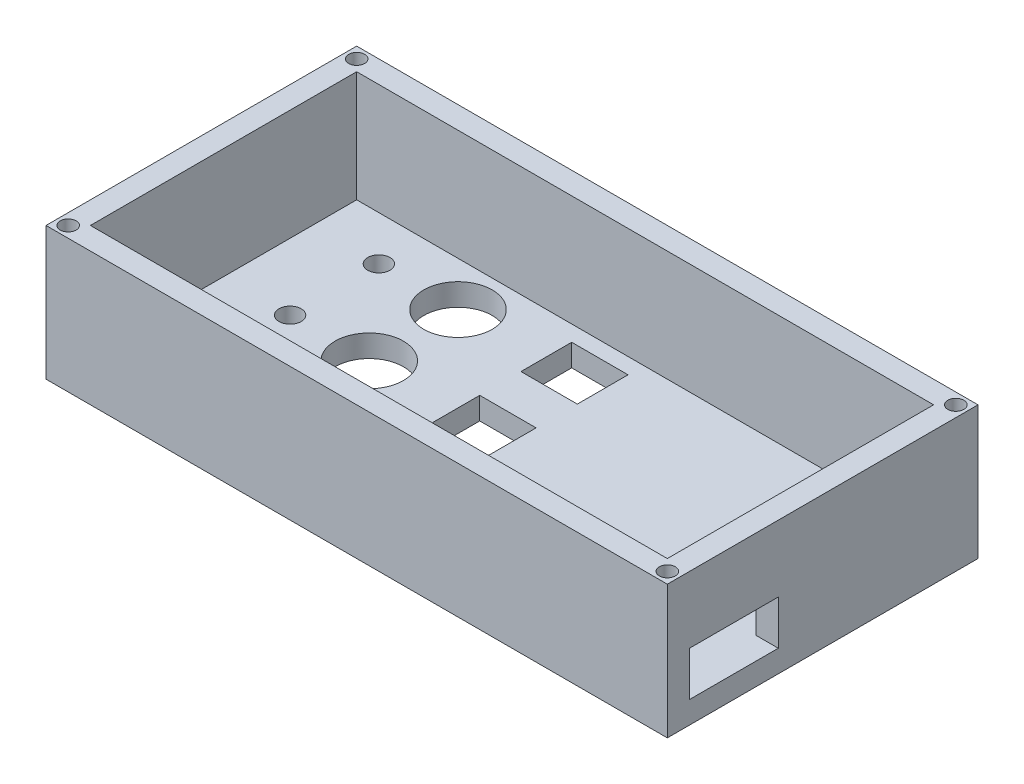
ISO-10303-21;
HEADER;
FILE_DESCRIPTION(('STEP AP214'),'2;1');
FILE_NAME('part.step','',(''),(''),'','','');
FILE_SCHEMA(('AUTOMOTIVE_DESIGN { 1 0 10303 214 1 1 1 1 }'));
ENDSEC;
DATA;
#1=APPLICATION_CONTEXT('core data for automotive mechanical design processes');
#2=APPLICATION_PROTOCOL_DEFINITION('international standard','automotive_design',2000,#1);
#3=PRODUCT_CONTEXT('',#1,'mechanical');
#4=PRODUCT('Part','Part','',(#3));
#5=PRODUCT_RELATED_PRODUCT_CATEGORY('part','',(#4));
#6=PRODUCT_DEFINITION_FORMATION('','',#4);
#7=PRODUCT_DEFINITION_CONTEXT('part definition',#1,'design');
#8=PRODUCT_DEFINITION('design','',#6,#7);
#9=PRODUCT_DEFINITION_SHAPE('','',#8);
#10=(LENGTH_UNIT() NAMED_UNIT(*) SI_UNIT(.MILLI.,.METRE.));
#11=(NAMED_UNIT(*) PLANE_ANGLE_UNIT() SI_UNIT($,.RADIAN.));
#12=(NAMED_UNIT(*) SI_UNIT($,.STERADIAN.) SOLID_ANGLE_UNIT());
#13=UNCERTAINTY_MEASURE_WITH_UNIT(LENGTH_MEASURE(1.E-05),#10,'distance_accuracy_value','');
#14=(GEOMETRIC_REPRESENTATION_CONTEXT(3) GLOBAL_UNCERTAINTY_ASSIGNED_CONTEXT((#13)) GLOBAL_UNIT_ASSIGNED_CONTEXT((#10,
#11,#12)) REPRESENTATION_CONTEXT('',''));
#15=CARTESIAN_POINT('',(0.,0.,0.));
#16=DIRECTION('',(0.,0.,1.));
#17=DIRECTION('',(1.,0.,0.));
#18=AXIS2_PLACEMENT_3D('',#15,#16,#17);
#19=CARTESIAN_POINT('',(135.,5.,0.));
#20=DIRECTION('',(1.,0.,0.));
#21=DIRECTION('',(0.,0.,-1.));
#22=AXIS2_PLACEMENT_3D('',#19,#20,#21);
#23=PLANE('',#22);
#24=DIRECTION('',(0.,0.,-1.));
#25=VECTOR('',#24,1.);
#26=CARTESIAN_POINT('',(135.,15.,0.));
#27=LINE('',#26,#25);
#28=CARTESIAN_POINT('',(135.,15.,-5.));
#29=VERTEX_POINT('',#28);
#30=CARTESIAN_POINT('',(135.,15.,-25.));
#31=VERTEX_POINT('',#30);
#32=EDGE_CURVE('E12',#29,#31,#27,.T.);
#33=ORIENTED_EDGE('',*,*,#32,.F.);
#34=DIRECTION('',(0.,1.,0.));
#35=VECTOR('',#34,1.);
#36=CARTESIAN_POINT('',(135.,5.,-5.));
#37=LINE('',#36,#35);
#38=CARTESIAN_POINT('',(135.,30.,-5.));
#39=VERTEX_POINT('',#38);
#40=EDGE_CURVE('E345',#29,#39,#37,.T.);
#41=ORIENTED_EDGE('',*,*,#40,.T.);
#42=DIRECTION('',(0.,0.,-1.));
#43=VECTOR('',#42,1.);
#44=CARTESIAN_POINT('',(135.,30.,0.));
#45=LINE('',#44,#43);
#46=CARTESIAN_POINT('',(135.,30.,-65.));
#47=VERTEX_POINT('',#46);
#48=EDGE_CURVE('E349',#39,#47,#45,.T.);
#49=ORIENTED_EDGE('',*,*,#48,.T.);
#50=DIRECTION('',(0.,1.,0.));
#51=VECTOR('',#50,1.);
#52=CARTESIAN_POINT('',(135.,5.,-65.));
#53=LINE('',#52,#51);
#54=CARTESIAN_POINT('',(135.,5.,-65.));
#55=VERTEX_POINT('',#54);
#56=EDGE_CURVE('E363',#55,#47,#53,.T.);
#57=ORIENTED_EDGE('',*,*,#56,.F.);
#58=DIRECTION('',(0.,0.,-1.));
#59=VECTOR('',#58,1.);
#60=CARTESIAN_POINT('',(135.,5.,0.));
#61=LINE('',#60,#59);
#62=CARTESIAN_POINT('',(135.,5.,-25.));
#63=VERTEX_POINT('',#62);
#64=EDGE_CURVE('E337',#63,#55,#61,.T.);
#65=ORIENTED_EDGE('',*,*,#64,.F.);
#66=DIRECTION('',(0.,1.,0.));
#67=VECTOR('',#66,1.);
#68=CARTESIAN_POINT('',(135.,5.,-25.));
#69=LINE('',#68,#67);
#70=EDGE_CURVE('E50',#63,#31,#69,.T.);
#71=ORIENTED_EDGE('',*,*,#70,.T.);
#72=EDGE_LOOP('',(#33,#41,#49,#57,#65,#71));
#73=FACE_BOUND('',#72,.T.);
#74=ADVANCED_FACE('F42',(#73),#23,.F.);
#75=CARTESIAN_POINT('',(0.,0.,0.));
#76=DIRECTION('',(0.,1.,0.));
#77=DIRECTION('',(0.,0.,1.));
#78=AXIS2_PLACEMENT_3D('',#75,#76,#77);
#79=PLANE('',#78);
#80=CARTESIAN_POINT('',(20.,0.,-15.));
#81=DIRECTION('',(0.,-1.,0.));
#82=DIRECTION('',(0.,0.,-1.));
#83=AXIS2_PLACEMENT_3D('',#80,#81,#82);
#84=CIRCLE('',#83,2.5);
#85=CARTESIAN_POINT('',(20.,0.,-17.5));
#86=VERTEX_POINT('',#85);
#87=EDGE_CURVE('E324',#86,#86,#84,.T.);
#88=ORIENTED_EDGE('',*,*,#87,.F.);
#89=EDGE_LOOP('',(#88));
#90=FACE_BOUND('',#89,.T.);
#91=CARTESIAN_POINT('',(37.8338224720955,0.,-15.));
#92=DIRECTION('',(0.,-1.,0.));
#93=DIRECTION('',(0.,0.,-1.));
#94=AXIS2_PLACEMENT_3D('',#91,#92,#93);
#95=CIRCLE('',#94,7.7);
#96=CARTESIAN_POINT('',(37.8338224720955,0.,-22.7));
#97=VERTEX_POINT('',#96);
#98=EDGE_CURVE('E300',#97,#97,#95,.T.);
#99=ORIENTED_EDGE('',*,*,#98,.F.);
#100=EDGE_LOOP('',(#99));
#101=FACE_BOUND('',#100,.T.);
#102=DIRECTION('',(0.,0.,-1.));
#103=VECTOR('',#102,1.);
#104=CARTESIAN_POINT('',(69.717644944191,0.,-50.));
#105=LINE('',#104,#103);
#106=CARTESIAN_POINT('',(69.717644944191,0.,-50.));
#107=VERTEX_POINT('',#106);
#108=CARTESIAN_POINT('',(69.717644944191,0.,-61.43));
#109=VERTEX_POINT('',#108);
#110=EDGE_CURVE('E270',#107,#109,#105,.T.);
#111=ORIENTED_EDGE('',*,*,#110,.T.);
#112=DIRECTION('',(1.,0.,0.));
#113=VECTOR('',#112,1.);
#114=CARTESIAN_POINT('',(57.017644944191,0.,-61.43));
#115=LINE('',#114,#113);
#116=CARTESIAN_POINT('',(57.017644944191,0.,-61.43));
#117=VERTEX_POINT('',#116);
#118=EDGE_CURVE('E273',#117,#109,#115,.T.);
#119=ORIENTED_EDGE('',*,*,#118,.F.);
#120=DIRECTION('',(0.,0.,-1.));
#121=VECTOR('',#120,1.);
#122=CARTESIAN_POINT('',(57.017644944191,0.,-50.));
#123=LINE('',#122,#121);
#124=CARTESIAN_POINT('',(57.017644944191,0.,-50.));
#125=VERTEX_POINT('',#124);
#126=EDGE_CURVE('E258',#125,#117,#123,.T.);
#127=ORIENTED_EDGE('',*,*,#126,.F.);
#128=DIRECTION('',(1.,0.,0.));
#129=VECTOR('',#128,1.);
#130=CARTESIAN_POINT('',(57.017644944191,0.,-50.));
#131=LINE('',#130,#129);
#132=EDGE_CURVE('E267',#125,#107,#131,.T.);
#133=ORIENTED_EDGE('',*,*,#132,.T.);
#134=EDGE_LOOP('',(#111,#119,#127,#133));
#135=FACE_BOUND('',#134,.T.);
#136=DIRECTION('',(1.,0.,0.));
#137=VECTOR('',#136,1.);
#138=CARTESIAN_POINT('',(0.,0.,-70.));
#139=LINE('',#138,#137);
#140=CARTESIAN_POINT('',(0.,0.,-70.));
#141=VERTEX_POINT('',#140);
#142=CARTESIAN_POINT('',(140.,0.,-70.));
#143=VERTEX_POINT('',#142);
#144=EDGE_CURVE('E360',#141,#143,#139,.T.);
#145=ORIENTED_EDGE('',*,*,#144,.T.);
#146=DIRECTION('',(0.,0.,-1.));
#147=VECTOR('',#146,1.);
#148=CARTESIAN_POINT('',(140.,0.,0.));
#149=LINE('',#148,#147);
#150=CARTESIAN_POINT('',(140.,0.,0.));
#151=VERTEX_POINT('',#150);
#152=EDGE_CURVE('E380',#151,#143,#149,.T.);
#153=ORIENTED_EDGE('',*,*,#152,.F.);
#154=DIRECTION('',(1.,0.,0.));
#155=VECTOR('',#154,1.);
#156=CARTESIAN_POINT('',(0.,0.,0.));
#157=LINE('',#156,#155);
#158=CARTESIAN_POINT('',(0.,0.,0.));
#159=VERTEX_POINT('',#158);
#160=EDGE_CURVE('E383',#159,#151,#157,.T.);
#161=ORIENTED_EDGE('',*,*,#160,.F.);
#162=DIRECTION('',(0.,0.,-1.));
#163=VECTOR('',#162,1.);
#164=CARTESIAN_POINT('',(0.,0.,0.));
#165=LINE('',#164,#163);
#166=EDGE_CURVE('E370',#159,#141,#165,.T.);
#167=ORIENTED_EDGE('',*,*,#166,.T.);
#168=EDGE_LOOP('',(#145,#153,#161,#167));
#169=FACE_BOUND('',#168,.T.);
#170=CARTESIAN_POINT('',(20.,0.,-55.));
#171=DIRECTION('',(0.,-1.,0.));
#172=DIRECTION('',(0.,0.,-1.));
#173=AXIS2_PLACEMENT_3D('',#170,#171,#172);
#174=CIRCLE('',#173,2.5);
#175=CARTESIAN_POINT('',(20.,0.,-57.5));
#176=VERTEX_POINT('',#175);
#177=EDGE_CURVE('E323',#176,#176,#174,.F.);
#178=ORIENTED_EDGE('',*,*,#177,.T.);
#179=EDGE_LOOP('',(#178));
#180=FACE_BOUND('',#179,.T.);
#181=DIRECTION('',(0.,0.,1.));
#182=VECTOR('',#181,1.);
#183=CARTESIAN_POINT('',(57.017644944191,0.,-15.));
#184=LINE('',#183,#182);
#185=CARTESIAN_POINT('',(57.017644944191,0.,-20.));
#186=VERTEX_POINT('',#185);
#187=CARTESIAN_POINT('',(57.017644944191,0.,-8.57000000000001));
#188=VERTEX_POINT('',#187);
#189=EDGE_CURVE('E297',#186,#188,#184,.T.);
#190=ORIENTED_EDGE('',*,*,#189,.T.);
#191=DIRECTION('',(1.,0.,0.));
#192=VECTOR('',#191,1.);
#193=CARTESIAN_POINT('',(57.017644944191,0.,-8.57000000000001));
#194=LINE('',#193,#192);
#195=CARTESIAN_POINT('',(69.717644944191,0.,-8.57000000000001));
#196=VERTEX_POINT('',#195);
#197=EDGE_CURVE('E294',#188,#196,#194,.T.);
#198=ORIENTED_EDGE('',*,*,#197,.T.);
#199=DIRECTION('',(0.,0.,-1.));
#200=VECTOR('',#199,1.);
#201=CARTESIAN_POINT('',(69.717644944191,0.,-8.57000000000001));
#202=LINE('',#201,#200);
#203=CARTESIAN_POINT('',(69.717644944191,0.,-20.));
#204=VERTEX_POINT('',#203);
#205=EDGE_CURVE('E291',#196,#204,#202,.T.);
#206=ORIENTED_EDGE('',*,*,#205,.T.);
#207=DIRECTION('',(-1.,0.,0.));
#208=VECTOR('',#207,1.);
#209=CARTESIAN_POINT('',(69.717644944191,0.,-20.));
#210=LINE('',#209,#208);
#211=EDGE_CURVE('E288',#204,#186,#210,.T.);
#212=ORIENTED_EDGE('',*,*,#211,.T.);
#213=EDGE_LOOP('',(#190,#198,#206,#212));
#214=FACE_BOUND('',#213,.T.);
#215=DIRECTION('',(1.,0.,0.));
#216=VECTOR('',#215,1.);
#217=CARTESIAN_POINT('',(57.017644944191,0.,-29.285));
#218=LINE('',#217,#216);
#219=CARTESIAN_POINT('',(57.017644944191,0.,-29.285));
#220=VERTEX_POINT('',#219);
#221=CARTESIAN_POINT('',(69.717644944191,0.,-29.285));
#222=VERTEX_POINT('',#221);
#223=EDGE_CURVE('E281',#220,#222,#218,.T.);
#224=ORIENTED_EDGE('',*,*,#223,.T.);
#225=DIRECTION('',(0.,0.,1.));
#226=VECTOR('',#225,1.);
#227=CARTESIAN_POINT('',(69.717644944191,0.,-40.715));
#228=LINE('',#227,#226);
#229=CARTESIAN_POINT('',(69.717644944191,0.,-40.715));
#230=VERTEX_POINT('',#229);
#231=EDGE_CURVE('E315',#230,#222,#228,.T.);
#232=ORIENTED_EDGE('',*,*,#231,.F.);
#233=DIRECTION('',(1.,0.,0.));
#234=VECTOR('',#233,1.);
#235=CARTESIAN_POINT('',(57.017644944191,0.,-40.715));
#236=LINE('',#235,#234);
#237=CARTESIAN_POINT('',(57.017644944191,0.,-40.715));
#238=VERTEX_POINT('',#237);
#239=EDGE_CURVE('E312',#238,#230,#236,.T.);
#240=ORIENTED_EDGE('',*,*,#239,.F.);
#241=DIRECTION('',(0.,0.,1.));
#242=VECTOR('',#241,1.);
#243=CARTESIAN_POINT('',(57.017644944191,0.,-40.715));
#244=LINE('',#243,#242);
#245=EDGE_CURVE('E309',#238,#220,#244,.T.);
#246=ORIENTED_EDGE('',*,*,#245,.T.);
#247=EDGE_LOOP('',(#224,#232,#240,#246));
#248=FACE_BOUND('',#247,.T.);
#249=CARTESIAN_POINT('',(37.8338224720955,0.,-35.));
#250=DIRECTION('',(0.,-1.,0.));
#251=DIRECTION('',(0.,0.,-1.));
#252=AXIS2_PLACEMENT_3D('',#249,#250,#251);
#253=CIRCLE('',#252,7.7);
#254=CARTESIAN_POINT('',(37.8338224720955,0.,-42.7));
#255=VERTEX_POINT('',#254);
#256=EDGE_CURVE('E252',#255,#255,#253,.T.);
#257=ORIENTED_EDGE('',*,*,#256,.F.);
#258=EDGE_LOOP('',(#257));
#259=FACE_BOUND('',#258,.T.);
#260=CARTESIAN_POINT('',(37.8338224720955,0.,-55.));
#261=DIRECTION('',(0.,-1.,0.));
#262=DIRECTION('',(0.,0.,-1.));
#263=AXIS2_PLACEMENT_3D('',#260,#261,#262);
#264=CIRCLE('',#263,7.7);
#265=CARTESIAN_POINT('',(37.8338224720955,0.,-62.7));
#266=VERTEX_POINT('',#265);
#267=EDGE_CURVE('E327',#266,#266,#264,.T.);
#268=ORIENTED_EDGE('',*,*,#267,.F.);
#269=EDGE_LOOP('',(#268));
#270=FACE_BOUND('',#269,.T.);
#271=CARTESIAN_POINT('',(20.,0.,-35.));
#272=DIRECTION('',(0.,-1.,0.));
#273=DIRECTION('',(0.,0.,-1.));
#274=AXIS2_PLACEMENT_3D('',#271,#272,#273);
#275=CIRCLE('',#274,2.5);
#276=CARTESIAN_POINT('',(20.,0.,-37.5));
#277=VERTEX_POINT('',#276);
#278=EDGE_CURVE('E320',#277,#277,#275,.T.);
#279=ORIENTED_EDGE('',*,*,#278,.F.);
#280=EDGE_LOOP('',(#279));
#281=FACE_BOUND('',#280,.T.);
#282=ADVANCED_FACE('F491',(#90,#101,#135,#169,#180,#214,#248,#259,#270,#281),#79,.F.);
#283=CARTESIAN_POINT('',(0.,5.,0.));
#284=DIRECTION('',(0.,1.,0.));
#285=DIRECTION('',(0.,0.,1.));
#286=AXIS2_PLACEMENT_3D('',#283,#284,#285);
#287=PLANE('',#286);
#288=DIRECTION('',(1.,0.,0.));
#289=VECTOR('',#288,1.);
#290=CARTESIAN_POINT('',(115.,5.,-25.));
#291=LINE('',#290,#289);
#292=CARTESIAN_POINT('',(140.,5.,-25.));
#293=VERTEX_POINT('',#292);
#294=EDGE_CURVE('E249',#63,#293,#291,.T.);
#295=ORIENTED_EDGE('',*,*,#294,.F.);
#296=ORIENTED_EDGE('',*,*,#64,.T.);
#297=DIRECTION('',(1.,0.,0.));
#298=VECTOR('',#297,1.);
#299=CARTESIAN_POINT('',(0.,5.,-65.));
#300=LINE('',#299,#298);
#301=CARTESIAN_POINT('',(5.,5.,-65.));
#302=VERTEX_POINT('',#301);
#303=EDGE_CURVE('E340',#302,#55,#300,.T.);
#304=ORIENTED_EDGE('',*,*,#303,.F.);
#305=DIRECTION('',(0.,0.,-1.));
#306=VECTOR('',#305,1.);
#307=CARTESIAN_POINT('',(5.,5.,0.));
#308=LINE('',#307,#306);
#309=CARTESIAN_POINT('',(5.,5.,-5.));
#310=VERTEX_POINT('',#309);
#311=EDGE_CURVE('E343',#310,#302,#308,.T.);
#312=ORIENTED_EDGE('',*,*,#311,.F.);
#313=DIRECTION('',(1.,0.,0.));
#314=VECTOR('',#313,1.);
#315=CARTESIAN_POINT('',(0.,5.,-5.));
#316=LINE('',#315,#314);
#317=CARTESIAN_POINT('',(140.,5.,-5.));
#318=VERTEX_POINT('',#317);
#319=EDGE_CURVE('E335',#310,#318,#316,.T.);
#320=ORIENTED_EDGE('',*,*,#319,.T.);
#321=DIRECTION('',(0.,0.,-1.));
#322=VECTOR('',#321,1.);
#323=CARTESIAN_POINT('',(140.,5.,0.));
#324=LINE('',#323,#322);
#325=EDGE_CURVE('E57',#318,#293,#324,.T.);
#326=ORIENTED_EDGE('',*,*,#325,.T.);
#327=EDGE_LOOP('',(#295,#296,#304,#312,#320,#326));
#328=FACE_BOUND('',#327,.T.);
#329=CARTESIAN_POINT('',(20.,5.,-55.));
#330=DIRECTION('',(0.,1.,0.));
#331=DIRECTION('',(0.,0.,1.));
#332=AXIS2_PLACEMENT_3D('',#329,#330,#331);
#333=CIRCLE('',#332,2.5);
#334=CARTESIAN_POINT('',(20.,5.,-52.5));
#335=VERTEX_POINT('',#334);
#336=EDGE_CURVE('E334',#335,#335,#333,.F.);
#337=ORIENTED_EDGE('',*,*,#336,.T.);
#338=EDGE_LOOP('',(#337));
#339=FACE_BOUND('',#338,.T.);
#340=DIRECTION('',(-1.,0.,0.));
#341=VECTOR('',#340,1.);
#342=CARTESIAN_POINT('',(0.,5.,-8.57000000000001));
#343=LINE('',#342,#341);
#344=CARTESIAN_POINT('',(69.717644944191,5.,-8.57000000000001));
#345=VERTEX_POINT('',#344);
#346=CARTESIAN_POINT('',(57.017644944191,5.,-8.57000000000001));
#347=VERTEX_POINT('',#346);
#348=EDGE_CURVE('E404',#345,#347,#343,.T.);
#349=ORIENTED_EDGE('',*,*,#348,.T.);
#350=DIRECTION('',(0.,0.,-1.));
#351=VECTOR('',#350,1.);
#352=CARTESIAN_POINT('',(57.017644944191,5.,0.));
#353=LINE('',#352,#351);
#354=CARTESIAN_POINT('',(57.017644944191,5.,-20.));
#355=VERTEX_POINT('',#354);
#356=EDGE_CURVE('E407',#347,#355,#353,.T.);
#357=ORIENTED_EDGE('',*,*,#356,.T.);
#358=DIRECTION('',(1.,0.,0.));
#359=VECTOR('',#358,1.);
#360=CARTESIAN_POINT('',(0.,5.,-20.));
#361=LINE('',#360,#359);
#362=CARTESIAN_POINT('',(69.717644944191,5.,-20.));
#363=VERTEX_POINT('',#362);
#364=EDGE_CURVE('E389',#355,#363,#361,.T.);
#365=ORIENTED_EDGE('',*,*,#364,.T.);
#366=DIRECTION('',(0.,0.,1.));
#367=VECTOR('',#366,1.);
#368=CARTESIAN_POINT('',(69.717644944191,5.,0.));
#369=LINE('',#368,#367);
#370=EDGE_CURVE('E401',#363,#345,#369,.T.);
#371=ORIENTED_EDGE('',*,*,#370,.T.);
#372=EDGE_LOOP('',(#349,#357,#365,#371));
#373=FACE_BOUND('',#372,.T.);
#374=DIRECTION('',(0.,0.,-1.));
#375=VECTOR('',#374,1.);
#376=CARTESIAN_POINT('',(69.717644944191,5.,0.));
#377=LINE('',#376,#375);
#378=CARTESIAN_POINT('',(69.717644944191,5.,-29.285));
#379=VERTEX_POINT('',#378);
#380=CARTESIAN_POINT('',(69.717644944191,5.,-40.715));
#381=VERTEX_POINT('',#380);
#382=EDGE_CURVE('E416',#379,#381,#377,.T.);
#383=ORIENTED_EDGE('',*,*,#382,.F.);
#384=DIRECTION('',(-1.,0.,0.));
#385=VECTOR('',#384,1.);
#386=CARTESIAN_POINT('',(0.,5.,-29.285));
#387=LINE('',#386,#385);
#388=CARTESIAN_POINT('',(57.017644944191,5.,-29.285));
#389=VERTEX_POINT('',#388);
#390=EDGE_CURVE('E418',#379,#389,#387,.T.);
#391=ORIENTED_EDGE('',*,*,#390,.T.);
#392=DIRECTION('',(0.,0.,-1.));
#393=VECTOR('',#392,1.);
#394=CARTESIAN_POINT('',(57.017644944191,5.,0.));
#395=LINE('',#394,#393);
#396=CARTESIAN_POINT('',(57.017644944191,5.,-40.715));
#397=VERTEX_POINT('',#396);
#398=EDGE_CURVE('E410',#389,#397,#395,.T.);
#399=ORIENTED_EDGE('',*,*,#398,.T.);
#400=DIRECTION('',(-1.,0.,0.));
#401=VECTOR('',#400,1.);
#402=CARTESIAN_POINT('',(0.,5.,-40.715));
#403=LINE('',#402,#401);
#404=EDGE_CURVE('E413',#381,#397,#403,.T.);
#405=ORIENTED_EDGE('',*,*,#404,.F.);
#406=EDGE_LOOP('',(#383,#391,#399,#405));
#407=FACE_BOUND('',#406,.T.);
#408=DIRECTION('',(-1.,0.,0.));
#409=VECTOR('',#408,1.);
#410=CARTESIAN_POINT('',(0.,5.,-61.43));
#411=LINE('',#410,#409);
#412=CARTESIAN_POINT('',(69.717644944191,5.,-61.43));
#413=VERTEX_POINT('',#412);
#414=CARTESIAN_POINT('',(57.017644944191,5.,-61.43));
#415=VERTEX_POINT('',#414);
#416=EDGE_CURVE('E429',#413,#415,#411,.T.);
#417=ORIENTED_EDGE('',*,*,#416,.F.);
#418=DIRECTION('',(0.,0.,1.));
#419=VECTOR('',#418,1.);
#420=CARTESIAN_POINT('',(69.717644944191,5.,0.));
#421=LINE('',#420,#419);
#422=CARTESIAN_POINT('',(69.717644944191,5.,-50.));
#423=VERTEX_POINT('',#422);
#424=EDGE_CURVE('E421',#413,#423,#421,.T.);
#425=ORIENTED_EDGE('',*,*,#424,.T.);
#426=DIRECTION('',(-1.,0.,0.));
#427=VECTOR('',#426,1.);
#428=CARTESIAN_POINT('',(0.,5.,-50.));
#429=LINE('',#428,#427);
#430=CARTESIAN_POINT('',(57.017644944191,5.,-50.));
#431=VERTEX_POINT('',#430);
#432=EDGE_CURVE('E424',#423,#431,#429,.T.);
#433=ORIENTED_EDGE('',*,*,#432,.T.);
#434=DIRECTION('',(0.,0.,1.));
#435=VECTOR('',#434,1.);
#436=CARTESIAN_POINT('',(57.017644944191,5.,0.));
#437=LINE('',#436,#435);
#438=EDGE_CURVE('E427',#415,#431,#437,.T.);
#439=ORIENTED_EDGE('',*,*,#438,.F.);
#440=EDGE_LOOP('',(#417,#425,#433,#439));
#441=FACE_BOUND('',#440,.T.);
#442=CARTESIAN_POINT('',(37.8338224720955,5.,-35.));
#443=DIRECTION('',(0.,1.,0.));
#444=DIRECTION('',(0.,0.,1.));
#445=AXIS2_PLACEMENT_3D('',#442,#443,#444);
#446=CIRCLE('',#445,7.7);
#447=CARTESIAN_POINT('',(37.8338224720955,5.,-27.3));
#448=VERTEX_POINT('',#447);
#449=EDGE_CURVE('E398',#448,#448,#446,.T.);
#450=ORIENTED_EDGE('',*,*,#449,.F.);
#451=EDGE_LOOP('',(#450));
#452=FACE_BOUND('',#451,.T.);
#453=CARTESIAN_POINT('',(37.8338224720955,5.,-15.));
#454=DIRECTION('',(0.,1.,0.));
#455=DIRECTION('',(0.,0.,1.));
#456=AXIS2_PLACEMENT_3D('',#453,#454,#455);
#457=CIRCLE('',#456,7.7);
#458=CARTESIAN_POINT('',(37.8338224720955,5.,-7.3));
#459=VERTEX_POINT('',#458);
#460=EDGE_CURVE('E433',#459,#459,#457,.T.);
#461=ORIENTED_EDGE('',*,*,#460,.F.);
#462=EDGE_LOOP('',(#461));
#463=FACE_BOUND('',#462,.T.);
#464=CARTESIAN_POINT('',(37.8338224720955,5.,-55.));
#465=DIRECTION('',(0.,1.,0.));
#466=DIRECTION('',(0.,0.,1.));
#467=AXIS2_PLACEMENT_3D('',#464,#465,#466);
#468=CIRCLE('',#467,7.7);
#469=CARTESIAN_POINT('',(37.8338224720955,5.,-47.3));
#470=VERTEX_POINT('',#469);
#471=EDGE_CURVE('E436',#470,#470,#468,.T.);
#472=ORIENTED_EDGE('',*,*,#471,.F.);
#473=EDGE_LOOP('',(#472));
#474=FACE_BOUND('',#473,.T.);
#475=CARTESIAN_POINT('',(20.,5.,-15.));
#476=DIRECTION('',(0.,1.,0.));
#477=DIRECTION('',(0.,0.,1.));
#478=AXIS2_PLACEMENT_3D('',#475,#476,#477);
#479=CIRCLE('',#478,2.5);
#480=CARTESIAN_POINT('',(20.,5.,-12.5));
#481=VERTEX_POINT('',#480);
#482=EDGE_CURVE('E439',#481,#481,#479,.T.);
#483=ORIENTED_EDGE('',*,*,#482,.F.);
#484=EDGE_LOOP('',(#483));
#485=FACE_BOUND('',#484,.T.);
#486=CARTESIAN_POINT('',(20.,5.,-35.));
#487=DIRECTION('',(0.,1.,0.));
#488=DIRECTION('',(0.,0.,1.));
#489=AXIS2_PLACEMENT_3D('',#486,#487,#488);
#490=CIRCLE('',#489,2.5);
#491=CARTESIAN_POINT('',(20.,5.,-32.5));
#492=VERTEX_POINT('',#491);
#493=EDGE_CURVE('E350',#492,#492,#490,.T.);
#494=ORIENTED_EDGE('',*,*,#493,.F.);
#495=EDGE_LOOP('',(#494));
#496=FACE_BOUND('',#495,.T.);
#497=ADVANCED_FACE('F451',(#328,#339,#373,#407,#441,#452,#463,#474,#485,#496),#287,.T.);
#498=CARTESIAN_POINT('',(0.,30.,-70.));
#499=DIRECTION('',(0.,0.,-1.));
#500=DIRECTION('',(-1.,0.,0.));
#501=AXIS2_PLACEMENT_3D('',#498,#499,#500);
#502=PLANE('',#501);
#503=ORIENTED_EDGE('',*,*,#144,.F.);
#504=DIRECTION('',(0.,-1.,0.));
#505=VECTOR('',#504,1.);
#506=CARTESIAN_POINT('',(0.,30.,-70.));
#507=LINE('',#506,#505);
#508=CARTESIAN_POINT('',(0.,30.,-70.));
#509=VERTEX_POINT('',#508);
#510=EDGE_CURVE('E387',#509,#141,#507,.T.);
#511=ORIENTED_EDGE('',*,*,#510,.F.);
#512=DIRECTION('',(1.,0.,0.));
#513=VECTOR('',#512,1.);
#514=CARTESIAN_POINT('',(0.,30.,-70.));
#515=LINE('',#514,#513);
#516=CARTESIAN_POINT('',(140.,30.,-70.));
#517=VERTEX_POINT('',#516);
#518=EDGE_CURVE('E366',#509,#517,#515,.T.);
#519=ORIENTED_EDGE('',*,*,#518,.T.);
#520=DIRECTION('',(0.,-1.,0.));
#521=VECTOR('',#520,1.);
#522=CARTESIAN_POINT('',(140.,30.,-70.));
#523=LINE('',#522,#521);
#524=EDGE_CURVE('E377',#517,#143,#523,.T.);
#525=ORIENTED_EDGE('',*,*,#524,.T.);
#526=EDGE_LOOP('',(#503,#511,#519,#525));
#527=FACE_BOUND('',#526,.T.);
#528=ADVANCED_FACE('F44',(#527),#502,.T.);
#529=CARTESIAN_POINT('',(0.,30.,0.));
#530=DIRECTION('',(-1.,0.,0.));
#531=DIRECTION('',(0.,0.,1.));
#532=AXIS2_PLACEMENT_3D('',#529,#530,#531);
#533=PLANE('',#532);
#534=ORIENTED_EDGE('',*,*,#166,.F.);
#535=DIRECTION('',(0.,-1.,0.));
#536=VECTOR('',#535,1.);
#537=CARTESIAN_POINT('',(0.,30.,0.));
#538=LINE('',#537,#536);
#539=CARTESIAN_POINT('',(0.,30.,0.));
#540=VERTEX_POINT('',#539);
#541=EDGE_CURVE('E390',#540,#159,#538,.T.);
#542=ORIENTED_EDGE('',*,*,#541,.F.);
#543=DIRECTION('',(0.,0.,-1.));
#544=VECTOR('',#543,1.);
#545=CARTESIAN_POINT('',(0.,30.,0.));
#546=LINE('',#545,#544);
#547=EDGE_CURVE('E374',#540,#509,#546,.T.);
#548=ORIENTED_EDGE('',*,*,#547,.T.);
#549=ORIENTED_EDGE('',*,*,#510,.T.);
#550=EDGE_LOOP('',(#534,#542,#548,#549));
#551=FACE_BOUND('',#550,.T.);
#552=ADVANCED_FACE('F506',(#551),#533,.T.);
#553=CARTESIAN_POINT('',(0.,30.,0.));
#554=DIRECTION('',(0.,0.,-1.));
#555=DIRECTION('',(-1.,0.,0.));
#556=AXIS2_PLACEMENT_3D('',#553,#554,#555);
#557=PLANE('',#556);
#558=ORIENTED_EDGE('',*,*,#160,.T.);
#559=DIRECTION('',(0.,-1.,0.));
#560=VECTOR('',#559,1.);
#561=CARTESIAN_POINT('',(140.,30.,0.));
#562=LINE('',#561,#560);
#563=CARTESIAN_POINT('',(140.,30.,0.));
#564=VERTEX_POINT('',#563);
#565=EDGE_CURVE('E392',#564,#151,#562,.T.);
#566=ORIENTED_EDGE('',*,*,#565,.F.);
#567=DIRECTION('',(1.,0.,0.));
#568=VECTOR('',#567,1.);
#569=CARTESIAN_POINT('',(0.,30.,0.));
#570=LINE('',#569,#568);
#571=EDGE_CURVE('E372',#540,#564,#570,.T.);
#572=ORIENTED_EDGE('',*,*,#571,.F.);
#573=ORIENTED_EDGE('',*,*,#541,.T.);
#574=EDGE_LOOP('',(#558,#566,#572,#573));
#575=FACE_BOUND('',#574,.T.);
#576=ADVANCED_FACE('F509',(#575),#557,.F.);
#577=CARTESIAN_POINT('',(140.,30.,0.));
#578=DIRECTION('',(-1.,0.,0.));
#579=DIRECTION('',(0.,0.,1.));
#580=AXIS2_PLACEMENT_3D('',#577,#578,#579);
#581=PLANE('',#580);
#582=DIRECTION('',(0.,1.,0.));
#583=VECTOR('',#582,1.);
#584=CARTESIAN_POINT('',(140.,0.,-25.));
#585=LINE('',#584,#583);
#586=CARTESIAN_POINT('',(140.,15.,-25.));
#587=VERTEX_POINT('',#586);
#588=EDGE_CURVE('E241',#293,#587,#585,.T.);
#589=ORIENTED_EDGE('',*,*,#588,.F.);
#590=ORIENTED_EDGE('',*,*,#325,.F.);
#591=DIRECTION('',(0.,1.,0.));
#592=VECTOR('',#591,1.);
#593=CARTESIAN_POINT('',(140.,0.,-5.));
#594=LINE('',#593,#592);
#595=CARTESIAN_POINT('',(140.,15.,-5.));
#596=VERTEX_POINT('',#595);
#597=EDGE_CURVE('E246',#318,#596,#594,.T.);
#598=ORIENTED_EDGE('',*,*,#597,.T.);
#599=DIRECTION('',(0.,0.,-1.));
#600=VECTOR('',#599,1.);
#601=CARTESIAN_POINT('',(140.,15.,0.));
#602=LINE('',#601,#600);
#603=EDGE_CURVE('E243',#596,#587,#602,.T.);
#604=ORIENTED_EDGE('',*,*,#603,.T.);
#605=EDGE_LOOP('',(#589,#590,#598,#604));
#606=FACE_BOUND('',#605,.T.);
#607=ORIENTED_EDGE('',*,*,#152,.T.);
#608=ORIENTED_EDGE('',*,*,#524,.F.);
#609=DIRECTION('',(0.,0.,-1.));
#610=VECTOR('',#609,1.);
#611=CARTESIAN_POINT('',(140.,30.,0.));
#612=LINE('',#611,#610);
#613=EDGE_CURVE('E369',#564,#517,#612,.T.);
#614=ORIENTED_EDGE('',*,*,#613,.F.);
#615=ORIENTED_EDGE('',*,*,#565,.T.);
#616=EDGE_LOOP('',(#607,#608,#614,#615));
#617=FACE_BOUND('',#616,.T.);
#618=ADVANCED_FACE('F473',(#606,#617),#581,.F.);
#619=CARTESIAN_POINT('',(0.,30.,0.));
#620=DIRECTION('',(0.,1.,0.));
#621=DIRECTION('',(0.,0.,1.));
#622=AXIS2_PLACEMENT_3D('',#619,#620,#621);
#623=PLANE('',#622);
#624=CARTESIAN_POINT('',(2.5,30.,-2.5));
#625=DIRECTION('',(0.,1.,0.));
#626=DIRECTION('',(0.,0.,1.));
#627=AXIS2_PLACEMENT_3D('',#624,#625,#626);
#628=CIRCLE('',#627,1.8);
#629=CARTESIAN_POINT('',(2.5,30.,-0.7));
#630=VERTEX_POINT('',#629);
#631=EDGE_CURVE('E218',#630,#630,#628,.T.);
#632=ORIENTED_EDGE('',*,*,#631,.F.);
#633=EDGE_LOOP('',(#632));
#634=FACE_BOUND('',#633,.T.);
#635=CARTESIAN_POINT('',(2.5,30.,-67.5));
#636=DIRECTION('',(0.,1.,0.));
#637=DIRECTION('',(0.,0.,1.));
#638=AXIS2_PLACEMENT_3D('',#635,#636,#637);
#639=CIRCLE('',#638,1.8);
#640=CARTESIAN_POINT('',(2.5,30.,-65.7));
#641=VERTEX_POINT('',#640);
#642=EDGE_CURVE('E217',#641,#641,#639,.T.);
#643=ORIENTED_EDGE('',*,*,#642,.F.);
#644=EDGE_LOOP('',(#643));
#645=FACE_BOUND('',#644,.T.);
#646=CARTESIAN_POINT('',(137.5,30.,-67.5));
#647=DIRECTION('',(0.,1.,0.));
#648=DIRECTION('',(0.,0.,1.));
#649=AXIS2_PLACEMENT_3D('',#646,#647,#648);
#650=CIRCLE('',#649,1.8);
#651=CARTESIAN_POINT('',(137.5,30.,-65.7));
#652=VERTEX_POINT('',#651);
#653=EDGE_CURVE('E228',#652,#652,#650,.T.);
#654=ORIENTED_EDGE('',*,*,#653,.F.);
#655=EDGE_LOOP('',(#654));
#656=FACE_BOUND('',#655,.T.);
#657=CARTESIAN_POINT('',(137.5,30.,-2.5));
#658=DIRECTION('',(0.,1.,0.));
#659=DIRECTION('',(0.,0.,1.));
#660=AXIS2_PLACEMENT_3D('',#657,#658,#659);
#661=CIRCLE('',#660,1.8);
#662=CARTESIAN_POINT('',(137.5,30.,-0.700000000000004));
#663=VERTEX_POINT('',#662);
#664=EDGE_CURVE('E234',#663,#663,#661,.T.);
#665=ORIENTED_EDGE('',*,*,#664,.F.);
#666=EDGE_LOOP('',(#665));
#667=FACE_BOUND('',#666,.T.);
#668=DIRECTION('',(1.,0.,0.));
#669=VECTOR('',#668,1.);
#670=CARTESIAN_POINT('',(0.,30.,-5.));
#671=LINE('',#670,#669);
#672=CARTESIAN_POINT('',(5.,30.,-5.));
#673=VERTEX_POINT('',#672);
#674=EDGE_CURVE('E346',#673,#39,#671,.T.);
#675=ORIENTED_EDGE('',*,*,#674,.F.);
#676=DIRECTION('',(0.,0.,-1.));
#677=VECTOR('',#676,1.);
#678=CARTESIAN_POINT('',(5.,30.,0.));
#679=LINE('',#678,#677);
#680=CARTESIAN_POINT('',(5.,30.,-65.));
#681=VERTEX_POINT('',#680);
#682=EDGE_CURVE('E338',#673,#681,#679,.T.);
#683=ORIENTED_EDGE('',*,*,#682,.T.);
#684=DIRECTION('',(1.,0.,0.));
#685=VECTOR('',#684,1.);
#686=CARTESIAN_POINT('',(0.,30.,-65.));
#687=LINE('',#686,#685);
#688=EDGE_CURVE('E353',#681,#47,#687,.T.);
#689=ORIENTED_EDGE('',*,*,#688,.T.);
#690=ORIENTED_EDGE('',*,*,#48,.F.);
#691=EDGE_LOOP('',(#675,#683,#689,#690));
#692=FACE_BOUND('',#691,.T.);
#693=ORIENTED_EDGE('',*,*,#518,.F.);
#694=ORIENTED_EDGE('',*,*,#547,.F.);
#695=ORIENTED_EDGE('',*,*,#571,.T.);
#696=ORIENTED_EDGE('',*,*,#613,.T.);
#697=EDGE_LOOP('',(#693,#694,#695,#696));
#698=FACE_BOUND('',#697,.T.);
#699=ADVANCED_FACE('F462',(#634,#645,#656,#667,#692,#698),#623,.T.);
#700=CARTESIAN_POINT('',(0.,5.,-5.));
#701=DIRECTION('',(0.,0.,1.));
#702=DIRECTION('',(1.,0.,0.));
#703=AXIS2_PLACEMENT_3D('',#700,#701,#702);
#704=PLANE('',#703);
#705=ORIENTED_EDGE('',*,*,#40,.F.);
#706=DIRECTION('',(1.,0.,0.));
#707=VECTOR('',#706,1.);
#708=CARTESIAN_POINT('',(115.,15.,-5.));
#709=LINE('',#708,#707);
#710=EDGE_CURVE('E250',#29,#596,#709,.T.);
#711=ORIENTED_EDGE('',*,*,#710,.T.);
#712=ORIENTED_EDGE('',*,*,#597,.F.);
#713=ORIENTED_EDGE('',*,*,#319,.F.);
#714=DIRECTION('',(0.,1.,0.));
#715=VECTOR('',#714,1.);
#716=CARTESIAN_POINT('',(5.,5.,-5.));
#717=LINE('',#716,#715);
#718=EDGE_CURVE('E358',#310,#673,#717,.T.);
#719=ORIENTED_EDGE('',*,*,#718,.T.);
#720=ORIENTED_EDGE('',*,*,#674,.T.);
#721=EDGE_LOOP('',(#705,#711,#712,#713,#719,#720));
#722=FACE_BOUND('',#721,.T.);
#723=ADVANCED_FACE('F470',(#722),#704,.F.);
#724=CARTESIAN_POINT('',(5.,5.,0.));
#725=DIRECTION('',(1.,0.,0.));
#726=DIRECTION('',(0.,0.,-1.));
#727=AXIS2_PLACEMENT_3D('',#724,#725,#726);
#728=PLANE('',#727);
#729=ORIENTED_EDGE('',*,*,#682,.F.);
#730=ORIENTED_EDGE('',*,*,#718,.F.);
#731=ORIENTED_EDGE('',*,*,#311,.T.);
#732=DIRECTION('',(0.,1.,0.));
#733=VECTOR('',#732,1.);
#734=CARTESIAN_POINT('',(5.,5.,-65.));
#735=LINE('',#734,#733);
#736=EDGE_CURVE('E361',#302,#681,#735,.T.);
#737=ORIENTED_EDGE('',*,*,#736,.T.);
#738=EDGE_LOOP('',(#729,#730,#731,#737));
#739=FACE_BOUND('',#738,.T.);
#740=ADVANCED_FACE('F466',(#739),#728,.T.);
#741=CARTESIAN_POINT('',(0.,5.,-65.));
#742=DIRECTION('',(0.,0.,1.));
#743=DIRECTION('',(1.,0.,0.));
#744=AXIS2_PLACEMENT_3D('',#741,#742,#743);
#745=PLANE('',#744);
#746=ORIENTED_EDGE('',*,*,#688,.F.);
#747=ORIENTED_EDGE('',*,*,#736,.F.);
#748=ORIENTED_EDGE('',*,*,#303,.T.);
#749=ORIENTED_EDGE('',*,*,#56,.T.);
#750=EDGE_LOOP('',(#746,#747,#748,#749));
#751=FACE_BOUND('',#750,.T.);
#752=ADVANCED_FACE('F458',(#751),#745,.T.);
#753=CARTESIAN_POINT('',(20.,25.,-55.));
#754=DIRECTION('',(0.,-1.,0.));
#755=DIRECTION('',(0.,0.,-1.));
#756=AXIS2_PLACEMENT_3D('',#753,#754,#755);
#757=CYLINDRICAL_SURFACE('',#756,2.5);
#758=ORIENTED_EDGE('',*,*,#336,.F.);
#759=EDGE_LOOP('',(#758));
#760=FACE_BOUND('',#759,.T.);
#761=ORIENTED_EDGE('',*,*,#177,.F.);
#762=EDGE_LOOP('',(#761));
#763=FACE_BOUND('',#762,.T.);
#764=ADVANCED_FACE('F540',(#760,#763),#757,.F.);
#765=CARTESIAN_POINT('',(57.017644944191,25.,-15.));
#766=DIRECTION('',(1.,0.,0.));
#767=DIRECTION('',(0.,0.,-1.));
#768=AXIS2_PLACEMENT_3D('',#765,#766,#767);
#769=PLANE('',#768);
#770=DIRECTION('',(0.,-1.,0.));
#771=VECTOR('',#770,1.);
#772=CARTESIAN_POINT('',(57.017644944191,25.,-8.57000000000001));
#773=LINE('',#772,#771);
#774=EDGE_CURVE('E278',#347,#188,#773,.T.);
#775=ORIENTED_EDGE('',*,*,#774,.T.);
#776=ORIENTED_EDGE('',*,*,#189,.F.);
#777=DIRECTION('',(0.,-1.,0.));
#778=VECTOR('',#777,1.);
#779=CARTESIAN_POINT('',(57.017644944191,25.,-20.));
#780=LINE('',#779,#778);
#781=EDGE_CURVE('E285',#355,#186,#780,.T.);
#782=ORIENTED_EDGE('',*,*,#781,.F.);
#783=ORIENTED_EDGE('',*,*,#356,.F.);
#784=EDGE_LOOP('',(#775,#776,#782,#783));
#785=FACE_BOUND('',#784,.T.);
#786=ADVANCED_FACE('F547',(#785),#769,.T.);
#787=CARTESIAN_POINT('',(57.017644944191,25.,-8.57000000000001));
#788=DIRECTION('',(0.,0.,-1.));
#789=DIRECTION('',(-1.,0.,0.));
#790=AXIS2_PLACEMENT_3D('',#787,#788,#789);
#791=PLANE('',#790);
#792=DIRECTION('',(0.,-1.,0.));
#793=VECTOR('',#792,1.);
#794=CARTESIAN_POINT('',(69.717644944191,25.,-8.57000000000001));
#795=LINE('',#794,#793);
#796=EDGE_CURVE('E280',#345,#196,#795,.T.);
#797=ORIENTED_EDGE('',*,*,#796,.T.);
#798=ORIENTED_EDGE('',*,*,#197,.F.);
#799=ORIENTED_EDGE('',*,*,#774,.F.);
#800=ORIENTED_EDGE('',*,*,#348,.F.);
#801=EDGE_LOOP('',(#797,#798,#799,#800));
#802=FACE_BOUND('',#801,.T.);
#803=ADVANCED_FACE('F555',(#802),#791,.T.);
#804=CARTESIAN_POINT('',(69.717644944191,25.,-8.57000000000001));
#805=DIRECTION('',(-1.,0.,0.));
#806=DIRECTION('',(0.,0.,1.));
#807=AXIS2_PLACEMENT_3D('',#804,#805,#806);
#808=PLANE('',#807);
#809=DIRECTION('',(0.,-1.,0.));
#810=VECTOR('',#809,1.);
#811=CARTESIAN_POINT('',(69.717644944191,25.,-20.));
#812=LINE('',#811,#810);
#813=EDGE_CURVE('E283',#363,#204,#812,.T.);
#814=ORIENTED_EDGE('',*,*,#813,.T.);
#815=ORIENTED_EDGE('',*,*,#205,.F.);
#816=ORIENTED_EDGE('',*,*,#796,.F.);
#817=ORIENTED_EDGE('',*,*,#370,.F.);
#818=EDGE_LOOP('',(#814,#815,#816,#817));
#819=FACE_BOUND('',#818,.T.);
#820=ADVANCED_FACE('F563',(#819),#808,.T.);
#821=CARTESIAN_POINT('',(69.717644944191,25.,-20.));
#822=DIRECTION('',(0.,0.,1.));
#823=DIRECTION('',(1.,0.,0.));
#824=AXIS2_PLACEMENT_3D('',#821,#822,#823);
#825=PLANE('',#824);
#826=ORIENTED_EDGE('',*,*,#781,.T.);
#827=ORIENTED_EDGE('',*,*,#211,.F.);
#828=ORIENTED_EDGE('',*,*,#813,.F.);
#829=ORIENTED_EDGE('',*,*,#364,.F.);
#830=EDGE_LOOP('',(#826,#827,#828,#829));
#831=FACE_BOUND('',#830,.T.);
#832=ADVANCED_FACE('F571',(#831),#825,.T.);
#833=CARTESIAN_POINT('',(57.017644944191,25.,-29.285));
#834=DIRECTION('',(0.,0.,-1.));
#835=DIRECTION('',(-1.,0.,0.));
#836=AXIS2_PLACEMENT_3D('',#833,#834,#835);
#837=PLANE('',#836);
#838=DIRECTION('',(0.,-1.,0.));
#839=VECTOR('',#838,1.);
#840=CARTESIAN_POINT('',(69.717644944191,25.,-29.285));
#841=LINE('',#840,#839);
#842=EDGE_CURVE('E275',#379,#222,#841,.T.);
#843=ORIENTED_EDGE('',*,*,#842,.T.);
#844=ORIENTED_EDGE('',*,*,#223,.F.);
#845=DIRECTION('',(0.,-1.,0.));
#846=VECTOR('',#845,1.);
#847=CARTESIAN_POINT('',(57.017644944191,25.,-29.285));
#848=LINE('',#847,#846);
#849=EDGE_CURVE('E306',#389,#220,#848,.T.);
#850=ORIENTED_EDGE('',*,*,#849,.F.);
#851=ORIENTED_EDGE('',*,*,#390,.F.);
#852=EDGE_LOOP('',(#843,#844,#850,#851));
#853=FACE_BOUND('',#852,.T.);
#854=ADVANCED_FACE('F579',(#853),#837,.T.);
#855=CARTESIAN_POINT('',(69.717644944191,25.,-40.715));
#856=DIRECTION('',(1.,0.,0.));
#857=DIRECTION('',(0.,0.,-1.));
#858=AXIS2_PLACEMENT_3D('',#855,#856,#857);
#859=PLANE('',#858);
#860=ORIENTED_EDGE('',*,*,#382,.T.);
#861=DIRECTION('',(0.,-1.,0.));
#862=VECTOR('',#861,1.);
#863=CARTESIAN_POINT('',(69.717644944191,25.,-40.715));
#864=LINE('',#863,#862);
#865=EDGE_CURVE('E302',#381,#230,#864,.T.);
#866=ORIENTED_EDGE('',*,*,#865,.T.);
#867=ORIENTED_EDGE('',*,*,#231,.T.);
#868=ORIENTED_EDGE('',*,*,#842,.F.);
#869=EDGE_LOOP('',(#860,#866,#867,#868));
#870=FACE_BOUND('',#869,.T.);
#871=ADVANCED_FACE('F587',(#870),#859,.F.);
#872=CARTESIAN_POINT('',(57.017644944191,25.,-40.715));
#873=DIRECTION('',(0.,0.,-1.));
#874=DIRECTION('',(-1.,0.,0.));
#875=AXIS2_PLACEMENT_3D('',#872,#873,#874);
#876=PLANE('',#875);
#877=ORIENTED_EDGE('',*,*,#404,.T.);
#878=DIRECTION('',(0.,-1.,0.));
#879=VECTOR('',#878,1.);
#880=CARTESIAN_POINT('',(57.017644944191,25.,-40.715));
#881=LINE('',#880,#879);
#882=EDGE_CURVE('E304',#397,#238,#881,.T.);
#883=ORIENTED_EDGE('',*,*,#882,.T.);
#884=ORIENTED_EDGE('',*,*,#239,.T.);
#885=ORIENTED_EDGE('',*,*,#865,.F.);
#886=EDGE_LOOP('',(#877,#883,#884,#885));
#887=FACE_BOUND('',#886,.T.);
#888=ADVANCED_FACE('F595',(#887),#876,.F.);
#889=CARTESIAN_POINT('',(57.017644944191,25.,-40.715));
#890=DIRECTION('',(1.,0.,0.));
#891=DIRECTION('',(0.,0.,-1.));
#892=AXIS2_PLACEMENT_3D('',#889,#890,#891);
#893=PLANE('',#892);
#894=ORIENTED_EDGE('',*,*,#849,.T.);
#895=ORIENTED_EDGE('',*,*,#245,.F.);
#896=ORIENTED_EDGE('',*,*,#882,.F.);
#897=ORIENTED_EDGE('',*,*,#398,.F.);
#898=EDGE_LOOP('',(#894,#895,#896,#897));
#899=FACE_BOUND('',#898,.T.);
#900=ADVANCED_FACE('F603',(#899),#893,.T.);
#901=CARTESIAN_POINT('',(57.017644944191,25.,-61.43));
#902=DIRECTION('',(0.,0.,-1.));
#903=DIRECTION('',(-1.,0.,0.));
#904=AXIS2_PLACEMENT_3D('',#901,#902,#903);
#905=PLANE('',#904);
#906=ORIENTED_EDGE('',*,*,#416,.T.);
#907=DIRECTION('',(0.,-1.,0.));
#908=VECTOR('',#907,1.);
#909=CARTESIAN_POINT('',(57.017644944191,25.,-61.43));
#910=LINE('',#909,#908);
#911=EDGE_CURVE('E263',#415,#117,#910,.T.);
#912=ORIENTED_EDGE('',*,*,#911,.T.);
#913=ORIENTED_EDGE('',*,*,#118,.T.);
#914=DIRECTION('',(0.,-1.,0.));
#915=VECTOR('',#914,1.);
#916=CARTESIAN_POINT('',(69.717644944191,25.,-61.43));
#917=LINE('',#916,#915);
#918=EDGE_CURVE('E255',#413,#109,#917,.T.);
#919=ORIENTED_EDGE('',*,*,#918,.F.);
#920=EDGE_LOOP('',(#906,#912,#913,#919));
#921=FACE_BOUND('',#920,.T.);
#922=ADVANCED_FACE('F611',(#921),#905,.F.);
#923=CARTESIAN_POINT('',(57.017644944191,25.,-50.));
#924=DIRECTION('',(-1.,0.,0.));
#925=DIRECTION('',(0.,0.,1.));
#926=AXIS2_PLACEMENT_3D('',#923,#924,#925);
#927=PLANE('',#926);
#928=ORIENTED_EDGE('',*,*,#438,.T.);
#929=DIRECTION('',(0.,-1.,0.));
#930=VECTOR('',#929,1.);
#931=CARTESIAN_POINT('',(57.017644944191,25.,-50.));
#932=LINE('',#931,#930);
#933=EDGE_CURVE('E261',#431,#125,#932,.T.);
#934=ORIENTED_EDGE('',*,*,#933,.T.);
#935=ORIENTED_EDGE('',*,*,#126,.T.);
#936=ORIENTED_EDGE('',*,*,#911,.F.);
#937=EDGE_LOOP('',(#928,#934,#935,#936));
#938=FACE_BOUND('',#937,.T.);
#939=ADVANCED_FACE('F619',(#938),#927,.F.);
#940=CARTESIAN_POINT('',(57.017644944191,25.,-50.));
#941=DIRECTION('',(0.,0.,-1.));
#942=DIRECTION('',(-1.,0.,0.));
#943=AXIS2_PLACEMENT_3D('',#940,#941,#942);
#944=PLANE('',#943);
#945=DIRECTION('',(0.,-1.,0.));
#946=VECTOR('',#945,1.);
#947=CARTESIAN_POINT('',(69.717644944191,25.,-50.));
#948=LINE('',#947,#946);
#949=EDGE_CURVE('E259',#423,#107,#948,.T.);
#950=ORIENTED_EDGE('',*,*,#949,.T.);
#951=ORIENTED_EDGE('',*,*,#132,.F.);
#952=ORIENTED_EDGE('',*,*,#933,.F.);
#953=ORIENTED_EDGE('',*,*,#432,.F.);
#954=EDGE_LOOP('',(#950,#951,#952,#953));
#955=FACE_BOUND('',#954,.T.);
#956=ADVANCED_FACE('F627',(#955),#944,.T.);
#957=CARTESIAN_POINT('',(69.717644944191,25.,-50.));
#958=DIRECTION('',(-1.,0.,0.));
#959=DIRECTION('',(0.,0.,1.));
#960=AXIS2_PLACEMENT_3D('',#957,#958,#959);
#961=PLANE('',#960);
#962=ORIENTED_EDGE('',*,*,#918,.T.);
#963=ORIENTED_EDGE('',*,*,#110,.F.);
#964=ORIENTED_EDGE('',*,*,#949,.F.);
#965=ORIENTED_EDGE('',*,*,#424,.F.);
#966=EDGE_LOOP('',(#962,#963,#964,#965));
#967=FACE_BOUND('',#966,.T.);
#968=ADVANCED_FACE('F635',(#967),#961,.T.);
#969=CARTESIAN_POINT('',(37.8338224720955,25.,-35.));
#970=DIRECTION('',(0.,-1.,0.));
#971=DIRECTION('',(0.,0.,-1.));
#972=AXIS2_PLACEMENT_3D('',#969,#970,#971);
#973=CYLINDRICAL_SURFACE('',#972,7.7);
#974=ORIENTED_EDGE('',*,*,#449,.T.);
#975=EDGE_LOOP('',(#974));
#976=FACE_BOUND('',#975,.T.);
#977=ORIENTED_EDGE('',*,*,#256,.T.);
#978=EDGE_LOOP('',(#977));
#979=FACE_BOUND('',#978,.T.);
#980=ADVANCED_FACE('F643',(#976,#979),#973,.F.);
#981=CARTESIAN_POINT('',(37.8338224720955,25.,-15.));
#982=DIRECTION('',(0.,-1.,0.));
#983=DIRECTION('',(0.,0.,-1.));
#984=AXIS2_PLACEMENT_3D('',#981,#982,#983);
#985=CYLINDRICAL_SURFACE('',#984,7.7);
#986=ORIENTED_EDGE('',*,*,#460,.T.);
#987=EDGE_LOOP('',(#986));
#988=FACE_BOUND('',#987,.T.);
#989=ORIENTED_EDGE('',*,*,#98,.T.);
#990=EDGE_LOOP('',(#989));
#991=FACE_BOUND('',#990,.T.);
#992=ADVANCED_FACE('F651',(#988,#991),#985,.F.);
#993=CARTESIAN_POINT('',(37.8338224720955,25.,-55.));
#994=DIRECTION('',(0.,-1.,0.));
#995=DIRECTION('',(0.,0.,-1.));
#996=AXIS2_PLACEMENT_3D('',#993,#994,#995);
#997=CYLINDRICAL_SURFACE('',#996,7.7);
#998=ORIENTED_EDGE('',*,*,#471,.T.);
#999=EDGE_LOOP('',(#998));
#1000=FACE_BOUND('',#999,.T.);
#1001=ORIENTED_EDGE('',*,*,#267,.T.);
#1002=EDGE_LOOP('',(#1001));
#1003=FACE_BOUND('',#1002,.T.);
#1004=ADVANCED_FACE('F659',(#1000,#1003),#997,.F.);
#1005=CARTESIAN_POINT('',(20.,25.,-15.));
#1006=DIRECTION('',(0.,-1.,0.));
#1007=DIRECTION('',(0.,0.,-1.));
#1008=AXIS2_PLACEMENT_3D('',#1005,#1006,#1007);
#1009=CYLINDRICAL_SURFACE('',#1008,2.5);
#1010=ORIENTED_EDGE('',*,*,#482,.T.);
#1011=EDGE_LOOP('',(#1010));
#1012=FACE_BOUND('',#1011,.T.);
#1013=ORIENTED_EDGE('',*,*,#87,.T.);
#1014=EDGE_LOOP('',(#1013));
#1015=FACE_BOUND('',#1014,.T.);
#1016=ADVANCED_FACE('F486',(#1012,#1015),#1009,.F.);
#1017=CARTESIAN_POINT('',(20.,25.,-35.));
#1018=DIRECTION('',(0.,-1.,0.));
#1019=DIRECTION('',(0.,0.,-1.));
#1020=AXIS2_PLACEMENT_3D('',#1017,#1018,#1019);
#1021=CYLINDRICAL_SURFACE('',#1020,2.5);
#1022=ORIENTED_EDGE('',*,*,#493,.T.);
#1023=EDGE_LOOP('',(#1022));
#1024=FACE_BOUND('',#1023,.T.);
#1025=ORIENTED_EDGE('',*,*,#278,.T.);
#1026=EDGE_LOOP('',(#1025));
#1027=FACE_BOUND('',#1026,.T.);
#1028=ADVANCED_FACE('F478',(#1024,#1027),#1021,.F.);
#1029=CARTESIAN_POINT('',(115.,15.,0.));
#1030=DIRECTION('',(0.,-1.,0.));
#1031=DIRECTION('',(0.,0.,-1.));
#1032=AXIS2_PLACEMENT_3D('',#1029,#1030,#1031);
#1033=PLANE('',#1032);
#1034=ORIENTED_EDGE('',*,*,#32,.T.);
#1035=DIRECTION('',(1.,0.,0.));
#1036=VECTOR('',#1035,1.);
#1037=CARTESIAN_POINT('',(115.,15.,-25.));
#1038=LINE('',#1037,#1036);
#1039=EDGE_CURVE('E65',#31,#587,#1038,.T.);
#1040=ORIENTED_EDGE('',*,*,#1039,.T.);
#1041=ORIENTED_EDGE('',*,*,#603,.F.);
#1042=ORIENTED_EDGE('',*,*,#710,.F.);
#1043=EDGE_LOOP('',(#1034,#1040,#1041,#1042));
#1044=FACE_BOUND('',#1043,.T.);
#1045=ADVANCED_FACE('F476',(#1044),#1033,.T.);
#1046=CARTESIAN_POINT('',(115.,0.,-25.));
#1047=DIRECTION('',(0.,0.,-1.));
#1048=DIRECTION('',(-1.,0.,0.));
#1049=AXIS2_PLACEMENT_3D('',#1046,#1047,#1048);
#1050=PLANE('',#1049);
#1051=ORIENTED_EDGE('',*,*,#294,.T.);
#1052=ORIENTED_EDGE('',*,*,#588,.T.);
#1053=ORIENTED_EDGE('',*,*,#1039,.F.);
#1054=ORIENTED_EDGE('',*,*,#70,.F.);
#1055=EDGE_LOOP('',(#1051,#1052,#1053,#1054));
#1056=FACE_BOUND('',#1055,.T.);
#1057=ADVANCED_FACE('F449',(#1056),#1050,.F.);
#1058=CARTESIAN_POINT('',(137.5,25.,-2.5));
#1059=DIRECTION('',(0.,1.,0.));
#1060=DIRECTION('',(0.,0.,1.));
#1061=AXIS2_PLACEMENT_3D('',#1058,#1059,#1060);
#1062=CONICAL_SURFACE('',#1061,1.8,1.02974425867665);
#1063=CARTESIAN_POINT('',(137.5,23.9184508857504,-2.5));
#1064=VERTEX_POINT('',#1063);
#1065=VERTEX_LOOP('',#1064);
#1066=FACE_BOUND('',#1065,.T.);
#1067=CARTESIAN_POINT('',(137.5,25.,-2.5));
#1068=DIRECTION('',(0.,1.,0.));
#1069=DIRECTION('',(0.,0.,1.));
#1070=AXIS2_PLACEMENT_3D('',#1067,#1068,#1069);
#1071=CIRCLE('',#1070,1.8);
#1072=CARTESIAN_POINT('',(137.5,25.,-0.700000000000004));
#1073=VERTEX_POINT('',#1072);
#1074=EDGE_CURVE('E237',#1073,#1073,#1071,.T.);
#1075=ORIENTED_EDGE('',*,*,#1074,.T.);
#1076=EDGE_LOOP('',(#1075));
#1077=FACE_BOUND('',#1076,.T.);
#1078=ADVANCED_FACE('F484',(#1066,#1077),#1062,.F.);
#1079=CARTESIAN_POINT('',(137.5,30.,-2.5));
#1080=DIRECTION('',(0.,1.,0.));
#1081=DIRECTION('',(0.,0.,1.));
#1082=AXIS2_PLACEMENT_3D('',#1079,#1080,#1081);
#1083=CYLINDRICAL_SURFACE('',#1082,1.8);
#1084=ORIENTED_EDGE('',*,*,#1074,.F.);
#1085=EDGE_LOOP('',(#1084));
#1086=FACE_BOUND('',#1085,.T.);
#1087=ORIENTED_EDGE('',*,*,#664,.T.);
#1088=EDGE_LOOP('',(#1087));
#1089=FACE_BOUND('',#1088,.T.);
#1090=ADVANCED_FACE('F804',(#1086,#1089),#1083,.F.);
#1091=CARTESIAN_POINT('',(137.5,25.,-67.5));
#1092=DIRECTION('',(0.,1.,0.));
#1093=DIRECTION('',(0.,0.,1.));
#1094=AXIS2_PLACEMENT_3D('',#1091,#1092,#1093);
#1095=CONICAL_SURFACE('',#1094,1.8,1.02974425867665);
#1096=CARTESIAN_POINT('',(137.5,23.9184508857504,-67.5));
#1097=VERTEX_POINT('',#1096);
#1098=VERTEX_LOOP('',#1097);
#1099=FACE_BOUND('',#1098,.T.);
#1100=CARTESIAN_POINT('',(137.5,25.,-67.5));
#1101=DIRECTION('',(0.,1.,0.));
#1102=DIRECTION('',(0.,0.,1.));
#1103=AXIS2_PLACEMENT_3D('',#1100,#1101,#1102);
#1104=CIRCLE('',#1103,1.8);
#1105=CARTESIAN_POINT('',(137.5,25.,-65.7));
#1106=VERTEX_POINT('',#1105);
#1107=EDGE_CURVE('E231',#1106,#1106,#1104,.T.);
#1108=ORIENTED_EDGE('',*,*,#1107,.T.);
#1109=EDGE_LOOP('',(#1108));
#1110=FACE_BOUND('',#1109,.T.);
#1111=ADVANCED_FACE('F812',(#1099,#1110),#1095,.F.);
#1112=CARTESIAN_POINT('',(137.5,30.,-67.5));
#1113=DIRECTION('',(0.,1.,0.));
#1114=DIRECTION('',(0.,0.,1.));
#1115=AXIS2_PLACEMENT_3D('',#1112,#1113,#1114);
#1116=CYLINDRICAL_SURFACE('',#1115,1.8);
#1117=ORIENTED_EDGE('',*,*,#1107,.F.);
#1118=EDGE_LOOP('',(#1117));
#1119=FACE_BOUND('',#1118,.T.);
#1120=ORIENTED_EDGE('',*,*,#653,.T.);
#1121=EDGE_LOOP('',(#1120));
#1122=FACE_BOUND('',#1121,.T.);
#1123=ADVANCED_FACE('F821',(#1119,#1122),#1116,.F.);
#1124=CARTESIAN_POINT('',(2.5,25.,-67.5));
#1125=DIRECTION('',(0.,1.,0.));
#1126=DIRECTION('',(0.,0.,1.));
#1127=AXIS2_PLACEMENT_3D('',#1124,#1125,#1126);
#1128=CONICAL_SURFACE('',#1127,1.8,1.02974425867665);
#1129=CARTESIAN_POINT('',(2.5,23.9184508857504,-67.5));
#1130=VERTEX_POINT('',#1129);
#1131=VERTEX_LOOP('',#1130);
#1132=FACE_BOUND('',#1131,.T.);
#1133=CARTESIAN_POINT('',(2.5,25.,-67.5));
#1134=DIRECTION('',(0.,1.,0.));
#1135=DIRECTION('',(0.,0.,1.));
#1136=AXIS2_PLACEMENT_3D('',#1133,#1134,#1135);
#1137=CIRCLE('',#1136,1.8);
#1138=CARTESIAN_POINT('',(2.5,25.,-65.7));
#1139=VERTEX_POINT('',#1138);
#1140=EDGE_CURVE('E221',#1139,#1139,#1137,.T.);
#1141=ORIENTED_EDGE('',*,*,#1140,.T.);
#1142=EDGE_LOOP('',(#1141));
#1143=FACE_BOUND('',#1142,.T.);
#1144=ADVANCED_FACE('F830',(#1132,#1143),#1128,.F.);
#1145=CARTESIAN_POINT('',(2.5,30.,-67.5));
#1146=DIRECTION('',(0.,1.,0.));
#1147=DIRECTION('',(0.,0.,1.));
#1148=AXIS2_PLACEMENT_3D('',#1145,#1146,#1147);
#1149=CYLINDRICAL_SURFACE('',#1148,1.8);
#1150=ORIENTED_EDGE('',*,*,#1140,.F.);
#1151=EDGE_LOOP('',(#1150));
#1152=FACE_BOUND('',#1151,.T.);
#1153=ORIENTED_EDGE('',*,*,#642,.T.);
#1154=EDGE_LOOP('',(#1153));
#1155=FACE_BOUND('',#1154,.T.);
#1156=ADVANCED_FACE('F211',(#1152,#1155),#1149,.F.);
#1157=CARTESIAN_POINT('',(2.5,25.,-2.5));
#1158=DIRECTION('',(0.,1.,0.));
#1159=DIRECTION('',(0.,0.,1.));
#1160=AXIS2_PLACEMENT_3D('',#1157,#1158,#1159);
#1161=CONICAL_SURFACE('',#1160,1.8,1.02974425867665);
#1162=CARTESIAN_POINT('',(2.5,23.9184508857504,-2.5));
#1163=VERTEX_POINT('',#1162);
#1164=VERTEX_LOOP('',#1163);
#1165=FACE_BOUND('',#1164,.T.);
#1166=CARTESIAN_POINT('',(2.5,25.,-2.5));
#1167=DIRECTION('',(0.,1.,0.));
#1168=DIRECTION('',(0.,0.,1.));
#1169=AXIS2_PLACEMENT_3D('',#1166,#1167,#1168);
#1170=CIRCLE('',#1169,1.8);
#1171=CARTESIAN_POINT('',(2.5,25.,-0.700000000000002));
#1172=VERTEX_POINT('',#1171);
#1173=EDGE_CURVE('E215',#1172,#1172,#1170,.T.);
#1174=ORIENTED_EDGE('',*,*,#1173,.T.);
#1175=EDGE_LOOP('',(#1174));
#1176=FACE_BOUND('',#1175,.T.);
#1177=ADVANCED_FACE('F207',(#1165,#1176),#1161,.F.);
#1178=CARTESIAN_POINT('',(2.5,30.,-2.5));
#1179=DIRECTION('',(0.,1.,0.));
#1180=DIRECTION('',(0.,0.,1.));
#1181=AXIS2_PLACEMENT_3D('',#1178,#1179,#1180);
#1182=CYLINDRICAL_SURFACE('',#1181,1.8);
#1183=ORIENTED_EDGE('',*,*,#1173,.F.);
#1184=EDGE_LOOP('',(#1183));
#1185=FACE_BOUND('',#1184,.T.);
#1186=ORIENTED_EDGE('',*,*,#631,.T.);
#1187=EDGE_LOOP('',(#1186));
#1188=FACE_BOUND('',#1187,.T.);
#1189=ADVANCED_FACE('F210',(#1185,#1188),#1182,.F.);
#1190=CLOSED_SHELL('',(#74,#282,#497,#528,#552,#576,#618,#699,#723,#740,#752,#764,#786,#803,
#820,#832,#854,#871,#888,#900,#922,#939,#956,#968,#980,#992,#1004,#1016,#1028,#1045,#1057,#1078,
#1090,#1111,#1123,#1144,#1156,#1177,#1189));
#1191=MANIFOLD_SOLID_BREP('B2',#1190);
#1192=ADVANCED_BREP_SHAPE_REPRESENTATION('',(#18,#1191),#14);
#1193=SHAPE_DEFINITION_REPRESENTATION(#9,#1192);
ENDSEC;
END-ISO-10303-21;
